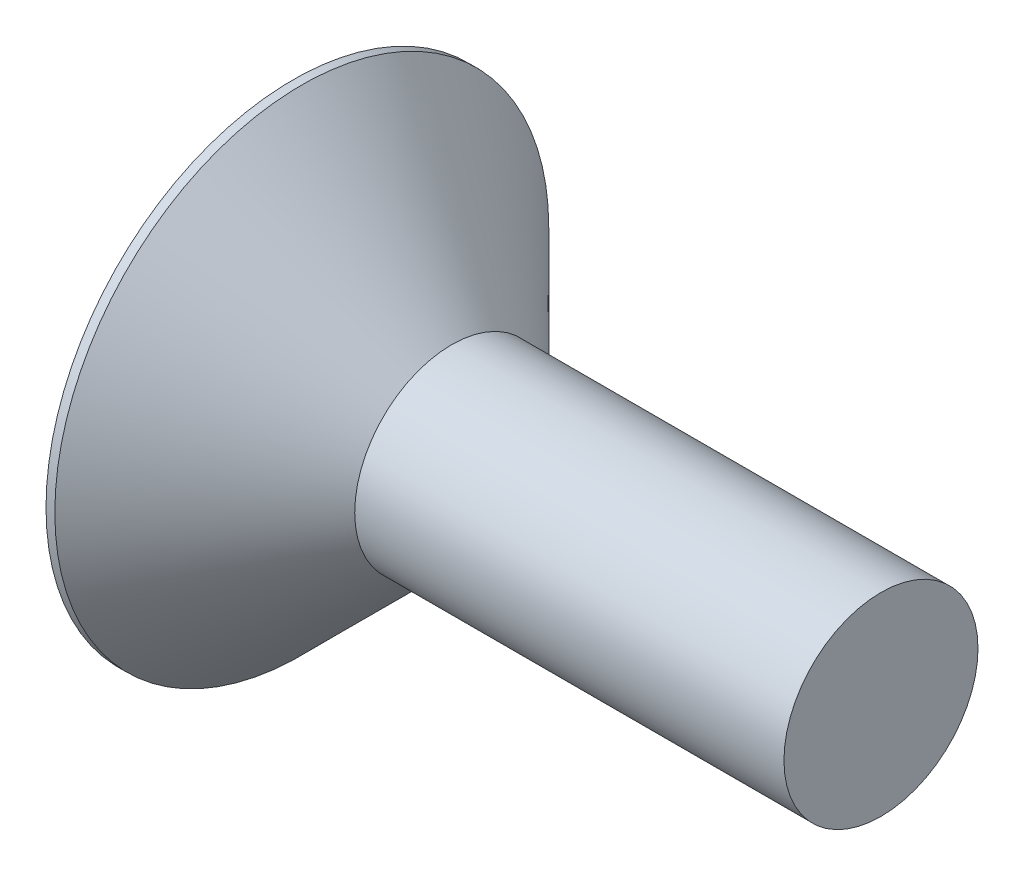
ISO-10303-21;
HEADER;
FILE_DESCRIPTION(('STEP AP214'),'2;1');
FILE_NAME('part.step','',(''),(''),'','','');
FILE_SCHEMA(('AUTOMOTIVE_DESIGN { 1 0 10303 214 1 1 1 1 }'));
ENDSEC;
DATA;
#1=APPLICATION_CONTEXT('core data for automotive mechanical design processes');
#2=APPLICATION_PROTOCOL_DEFINITION('international standard','automotive_design',2000,#1);
#3=PRODUCT_CONTEXT('',#1,'mechanical');
#4=PRODUCT('Part','Part','',(#3));
#5=PRODUCT_RELATED_PRODUCT_CATEGORY('part','',(#4));
#6=PRODUCT_DEFINITION_FORMATION('','',#4);
#7=PRODUCT_DEFINITION_CONTEXT('part definition',#1,'design');
#8=PRODUCT_DEFINITION('design','',#6,#7);
#9=PRODUCT_DEFINITION_SHAPE('','',#8);
#10=(LENGTH_UNIT() NAMED_UNIT(*) SI_UNIT(.MILLI.,.METRE.));
#11=(NAMED_UNIT(*) PLANE_ANGLE_UNIT() SI_UNIT($,.RADIAN.));
#12=(NAMED_UNIT(*) SI_UNIT($,.STERADIAN.) SOLID_ANGLE_UNIT());
#13=UNCERTAINTY_MEASURE_WITH_UNIT(LENGTH_MEASURE(1.E-05),#10,'distance_accuracy_value','');
#14=(GEOMETRIC_REPRESENTATION_CONTEXT(3) GLOBAL_UNCERTAINTY_ASSIGNED_CONTEXT((#13)) GLOBAL_UNIT_ASSIGNED_CONTEXT((#10,
#11,#12)) REPRESENTATION_CONTEXT('',''));
#15=CARTESIAN_POINT('',(0.,0.,0.));
#16=DIRECTION('',(0.,0.,1.));
#17=DIRECTION('',(1.,0.,0.));
#18=AXIS2_PLACEMENT_3D('',#15,#16,#17);
#19=CARTESIAN_POINT('',(2.51,-0.948560373066021,0.515));
#20=DIRECTION('',(0.,0.,-1.));
#21=DIRECTION('',(0.,1.,0.));
#22=AXIS2_PLACEMENT_3D('',#19,#20,#21);
#23=PLANE('',#22);
#24=DIRECTION('',(0.,-1.,0.));
#25=VECTOR('',#24,1.);
#26=CARTESIAN_POINT('',(0.,2.2,0.515));
#27=LINE('',#26,#25);
#28=CARTESIAN_POINT('',(0.,-0.887981255441156,0.515));
#29=VERTEX_POINT('',#28);
#30=CARTESIAN_POINT('',(0.,-2.2,0.515));
#31=VERTEX_POINT('',#30);
#32=EDGE_CURVE('E320',#29,#31,#27,.T.);
#33=ORIENTED_EDGE('',*,*,#32,.F.);
#34=CARTESIAN_POINT('',(-1.54977564647108,-1.01130800672325,0.515));
#35=CARTESIAN_POINT('',(-1.23788517270786,-0.986826571487756,0.515));
#36=CARTESIAN_POINT('',(-0.926007735565771,-0.962176117075243,0.515));
#37=CARTESIAN_POINT('',(-0.302275327552535,-0.912414378030123,0.515));
#38=CARTESIAN_POINT('',(0.00957964164275234,-0.887303072408851,0.515));
#39=CARTESIAN_POINT('',(0.477326867739133,-0.849200034708169,0.515));
#40=CARTESIAN_POINT('',(0.633236877534305,-0.836426330675361,0.515));
#41=CARTESIAN_POINT('',(0.945041873662967,-0.810710964612426,0.515));
#42=CARTESIAN_POINT('',(1.10093686010058,-0.797769303845589,0.515));
#43=CARTESIAN_POINT('',(1.41270333080025,-0.771692923127299,0.515));
#44=CARTESIAN_POINT('',(1.568574815822,-0.758558212266697,0.515));
#45=CARTESIAN_POINT('',(1.88030267392219,-0.732062350673588,0.515));
#46=CARTESIAN_POINT('',(2.03615904649583,-0.718701193999319,0.515));
#47=CARTESIAN_POINT('',(2.39015155243537,-0.688049903703303,0.515));
#48=CARTESIAN_POINT('',(2.58828060049309,-0.670677738711687,0.515));
#49=CARTESIAN_POINT('',(2.98448796441678,-0.635393509240391,0.515));
#50=CARTESIAN_POINT('',(3.18256628094361,-0.617481452196656,0.515));
#51=CARTESIAN_POINT('',(3.57863215535769,-0.580963231331761,0.515));
#52=CARTESIAN_POINT('',(3.77661972190122,-0.562357161801339,0.515));
#53=CARTESIAN_POINT('',(4.17251625795607,-0.524212007172804,0.515));
#54=CARTESIAN_POINT('',(4.37042522251482,-0.504672870529393,0.515));
#55=CARTESIAN_POINT('',(4.76621979461916,-0.464285859084882,0.515));
#56=CARTESIAN_POINT('',(4.96410533125768,-0.443437280097613,0.515));
#57=CARTESIAN_POINT('',(5.26075347563615,-0.410686203660742,0.515));
#58=CARTESIAN_POINT('',(5.35959766423708,-0.399523834486041,0.515));
#59=CARTESIAN_POINT('',(5.55721694475942,-0.376561771687499,0.515));
#60=CARTESIAN_POINT('',(5.65599203338541,-0.364762049521608,0.515));
#61=CARTESIAN_POINT('',(5.85350341178639,-0.340311623326566,0.515));
#62=CARTESIAN_POINT('',(5.95223963298654,-0.327660363079848,0.515));
#63=CARTESIAN_POINT('',(6.14954565491449,-0.301187906120118,0.515));
#64=CARTESIAN_POINT('',(6.24811547441257,-0.28736685180507,0.515));
#65=CARTESIAN_POINT('',(6.39580251584352,-0.265292479141727,0.515));
#66=CARTESIAN_POINT('',(6.44501926832323,-0.257707920234477,0.515));
#67=CARTESIAN_POINT('',(6.54335575747008,-0.241951993571022,0.515));
#68=CARTESIAN_POINT('',(6.59247550005062,-0.233780662792741,0.515));
#69=CARTESIAN_POINT('',(6.69060451408083,-0.216664965758528,0.515));
#70=CARTESIAN_POINT('',(6.73961373036193,-0.207720275734114,0.515));
#71=CARTESIAN_POINT('',(6.83741121304798,-0.188649708503354,0.515));
#72=CARTESIAN_POINT('',(6.88619942875591,-0.178523573247691,0.515));
#73=CARTESIAN_POINT('',(6.93482152088156,-0.167602986589417,0.515));
#74=B_SPLINE_CURVE_WITH_KNOTS('',3,(#34,#35,#36,#37,#38,#39,#40,#41,#42,#43,#44,#45,#46,#47,#48,
#49,#50,#51,#52,#53,#54,#55,#56,#57,#58,#59,#60,#61,#62,#63,#64,#65,#66,#67,#68,#69,#70,#71,#72,
#73),.UNSPECIFIED.,.F.,.F.,(4,2,2,2,2,2,2,2,2,2,2,2,2,2,2,2,2,2,2,4),(0.,0.938549774629289,
1.87714240047381,2.34643955056144,2.81573317286398,3.28500476619367,3.75428869196761,
4.35095567753757,4.94761444895151,5.54419244958818,6.14080344511287,6.73773807717728,
7.0361540303618,7.33458335835791,7.63320954593562,7.93179943415789,8.08118980055439,
8.23057076072988,8.38001456521923,8.52949107230012),.UNSPECIFIED.);
#75=CARTESIAN_POINT('',(2.51,-0.677477674908922,0.514999999999999));
#76=VERTEX_POINT('',#75);
#77=EDGE_CURVE('E200',#29,#76,#74,.T.);
#78=ORIENTED_EDGE('',*,*,#77,.T.);
#79=DIRECTION('',(0.,-1.,0.));
#80=VECTOR('',#79,1.);
#81=CARTESIAN_POINT('',(2.51,0.948560373066,0.515));
#82=LINE('',#81,#80);
#83=CARTESIAN_POINT('',(2.51,-0.948560373066021,0.515));
#84=VERTEX_POINT('',#83);
#85=EDGE_CURVE('E344',#76,#84,#82,.T.);
#86=ORIENTED_EDGE('',*,*,#85,.T.);
#87=DIRECTION('',(0.894934391398444,0.446197753347433,0.));
#88=VECTOR('',#87,1.);
#89=CARTESIAN_POINT('',(0.,-2.2,0.515));
#90=LINE('',#89,#88);
#91=EDGE_CURVE('E331',#31,#84,#90,.T.);
#92=ORIENTED_EDGE('',*,*,#91,.F.);
#93=EDGE_LOOP('',(#33,#78,#86,#92));
#94=FACE_BOUND('',#93,.T.);
#95=ADVANCED_FACE('F42',(#94),#23,.T.);
#96=CARTESIAN_POINT('',(2.51,0.948560373066,0.515));
#97=VERTEX_POINT('',#96);
#98=CARTESIAN_POINT('',(2.51,0.677477674908922,0.514999999999999));
#99=VERTEX_POINT('',#98);
#100=EDGE_CURVE('E346',#97,#99,#82,.T.);
#101=ORIENTED_EDGE('',*,*,#100,.T.);
#102=CARTESIAN_POINT('',(-1.54977564647108,1.01130800672325,0.515));
#103=CARTESIAN_POINT('',(-1.23788517270786,0.986826571487756,0.515));
#104=CARTESIAN_POINT('',(-0.92600773556577,0.962176117075243,0.515));
#105=CARTESIAN_POINT('',(-0.302275327552535,0.912414378030123,0.515));
#106=CARTESIAN_POINT('',(0.0095796416427524,0.887303072408851,0.515));
#107=CARTESIAN_POINT('',(0.477326867739133,0.849200034708169,0.515));
#108=CARTESIAN_POINT('',(0.633236877534305,0.836426330675361,0.515));
#109=CARTESIAN_POINT('',(0.945041873662967,0.810710964612426,0.515));
#110=CARTESIAN_POINT('',(1.10093686010058,0.797769303845589,0.515));
#111=CARTESIAN_POINT('',(1.41270333080025,0.7716929231273,0.515));
#112=CARTESIAN_POINT('',(1.56857481582201,0.758558212266697,0.515));
#113=CARTESIAN_POINT('',(1.8803026739222,0.732062350673588,0.515));
#114=CARTESIAN_POINT('',(2.03615904649584,0.718701193999319,0.515));
#115=CARTESIAN_POINT('',(2.39015155243537,0.688049903703303,0.515));
#116=CARTESIAN_POINT('',(2.58828060049309,0.670677738711687,0.515));
#117=CARTESIAN_POINT('',(2.98448796441678,0.635393509240391,0.515));
#118=CARTESIAN_POINT('',(3.18256628094361,0.617481452196656,0.515));
#119=CARTESIAN_POINT('',(3.57863215535769,0.580963231331761,0.515));
#120=CARTESIAN_POINT('',(3.77661972190122,0.562357161801339,0.515));
#121=CARTESIAN_POINT('',(4.17251625795608,0.524212007172804,0.515));
#122=CARTESIAN_POINT('',(4.37042522251483,0.504672870529393,0.515));
#123=CARTESIAN_POINT('',(4.76621979461917,0.464285859084882,0.515));
#124=CARTESIAN_POINT('',(4.96410533125768,0.443437280097613,0.515));
#125=CARTESIAN_POINT('',(5.26075347563615,0.410686203660742,0.515));
#126=CARTESIAN_POINT('',(5.35959766423708,0.399523834486041,0.515));
#127=CARTESIAN_POINT('',(5.55721694475942,0.376561771687499,0.515));
#128=CARTESIAN_POINT('',(5.65599203338541,0.364762049521608,0.515));
#129=CARTESIAN_POINT('',(5.8535034117864,0.340311623326566,0.515));
#130=CARTESIAN_POINT('',(5.95223963298654,0.327660363079848,0.515));
#131=CARTESIAN_POINT('',(6.14954565491449,0.301187906120117,0.515));
#132=CARTESIAN_POINT('',(6.24811547441257,0.28736685180507,0.515));
#133=CARTESIAN_POINT('',(6.39580251584353,0.265292479141726,0.515));
#134=CARTESIAN_POINT('',(6.44501926832323,0.257707920234476,0.515));
#135=CARTESIAN_POINT('',(6.54335575747008,0.241951993571022,0.515));
#136=CARTESIAN_POINT('',(6.59247550005062,0.233780662792741,0.515));
#137=CARTESIAN_POINT('',(6.69060451408084,0.216664965758528,0.515));
#138=CARTESIAN_POINT('',(6.73961373036193,0.207720275734114,0.515));
#139=CARTESIAN_POINT('',(6.83741121304798,0.188649708503353,0.515));
#140=CARTESIAN_POINT('',(6.88619942875591,0.178523573247691,0.515));
#141=CARTESIAN_POINT('',(6.93482152088157,0.167602986589416,0.515));
#142=B_SPLINE_CURVE_WITH_KNOTS('',3,(#102,#103,#104,#105,#106,#107,#108,#109,#110,#111,#112,
#113,#114,#115,#116,#117,#118,#119,#120,#121,#122,#123,#124,#125,#126,#127,#128,#129,#130,#131,
#132,#133,#134,#135,#136,#137,#138,#139,#140,#141),.UNSPECIFIED.,.F.,.F.,(4,2,2,2,2,2,2,2,2,2,2,
2,2,2,2,2,2,2,2,4),(0.,0.938549774629289,1.87714240047381,2.34643955056144,2.81573317286398,
3.28500476619367,3.75428869196761,4.35095567753757,4.94761444895151,5.54419244958818,
6.14080344511287,6.73773807717729,7.0361540303618,7.33458335835791,7.63320954593563,
7.93179943415789,8.0811898005544,8.23057076072988,8.38001456521923,8.52949107230012),.UNSPECIFIED.);
#143=CARTESIAN_POINT('',(0.,0.887981255441157,0.515));
#144=VERTEX_POINT('',#143);
#145=EDGE_CURVE('E193',#99,#144,#142,.F.);
#146=ORIENTED_EDGE('',*,*,#145,.T.);
#147=CARTESIAN_POINT('',(0.,2.2,0.515));
#148=VERTEX_POINT('',#147);
#149=EDGE_CURVE('E322',#148,#144,#27,.T.);
#150=ORIENTED_EDGE('',*,*,#149,.F.);
#151=DIRECTION('',(0.894934391398441,-0.446197753347439,0.));
#152=VECTOR('',#151,1.);
#153=CARTESIAN_POINT('',(0.,2.2,0.515));
#154=LINE('',#153,#152);
#155=EDGE_CURVE('E71',#148,#97,#154,.T.);
#156=ORIENTED_EDGE('',*,*,#155,.T.);
#157=EDGE_LOOP('',(#101,#146,#150,#156));
#158=FACE_BOUND('',#157,.T.);
#159=ADVANCED_FACE('F175',(#158),#23,.T.);
#160=CARTESIAN_POINT('',(2.51,0.948560373066,-0.515));
#161=DIRECTION('',(0.,0.,1.));
#162=DIRECTION('',(1.,0.,0.));
#163=AXIS2_PLACEMENT_3D('',#160,#161,#162);
#164=PLANE('',#163);
#165=DIRECTION('',(0.,1.,0.));
#166=VECTOR('',#165,1.);
#167=CARTESIAN_POINT('',(2.51,-0.948560373066021,-0.515));
#168=LINE('',#167,#166);
#169=CARTESIAN_POINT('',(2.51,-0.948560373066021,-0.515));
#170=VERTEX_POINT('',#169);
#171=CARTESIAN_POINT('',(2.51,-0.677477674908922,-0.514999999999999));
#172=VERTEX_POINT('',#171);
#173=EDGE_CURVE('E345',#170,#172,#168,.T.);
#174=ORIENTED_EDGE('',*,*,#173,.T.);
#175=CARTESIAN_POINT('',(-1.54977564528431,-1.01130800663012,-0.514999999999999));
#176=CARTESIAN_POINT('',(-1.23788517166282,-0.986826571405297,-0.515));
#177=CARTESIAN_POINT('',(-0.926007734662458,-0.962176117003548,-0.515));
#178=CARTESIAN_POINT('',(-0.302275326932694,-0.912414377980291,-0.515));
#179=CARTESIAN_POINT('',(0.00957964212084647,-0.887303072370117,-0.515));
#180=CARTESIAN_POINT('',(0.477326867945249,-0.849200034691274,-0.515));
#181=CARTESIAN_POINT('',(0.63323687761018,-0.836426330669084,-0.515));
#182=CARTESIAN_POINT('',(0.945041873478389,-0.810710964627669,-0.515));
#183=CARTESIAN_POINT('',(1.10093685978579,-0.797769303871732,-0.515));
#184=CARTESIAN_POINT('',(1.41270333022509,-0.771692923175592,-0.515));
#185=CARTESIAN_POINT('',(1.56857481511669,-0.758558212326239,-0.515));
#186=CARTESIAN_POINT('',(1.8803026729566,-0.732062350756069,-0.515));
#187=CARTESIAN_POINT('',(2.03615904540011,-0.71870119409349,-0.515));
#188=CARTESIAN_POINT('',(2.39015155120943,-0.688049903810352,-0.515));
#189=CARTESIAN_POINT('',(2.58828059926706,-0.670677738819741,-0.515));
#190=CARTESIAN_POINT('',(2.98448796319059,-0.635393509350721,-0.515));
#191=CARTESIAN_POINT('',(3.18256627971735,-0.617481452308258,-0.515));
#192=CARTESIAN_POINT('',(3.57863215413144,-0.580963231446289,-0.515));
#193=CARTESIAN_POINT('',(3.77661972067504,-0.56235716191752,-0.515));
#194=CARTESIAN_POINT('',(4.17251625673005,-0.524212007292897,-0.515));
#195=CARTESIAN_POINT('',(4.37042522128889,-0.504672870651743,-0.515));
#196=CARTESIAN_POINT('',(4.76621979339322,-0.464285859212756,-0.515));
#197=CARTESIAN_POINT('',(4.96410533003164,-0.443437280228755,-0.515));
#198=CARTESIAN_POINT('',(5.26075347441022,-0.410686203798173,-0.515));
#199=CARTESIAN_POINT('',(5.35959766301126,-0.399523834625795,-0.515));
#200=CARTESIAN_POINT('',(5.5572169435339,-0.376561771832591,-0.515));
#201=CARTESIAN_POINT('',(5.65599203216008,-0.364762049669715,-0.515));
#202=CARTESIAN_POINT('',(5.85350341056136,-0.340311623481798,-0.515));
#203=CARTESIAN_POINT('',(5.95223963176162,-0.327660363239192,-0.515));
#204=CARTESIAN_POINT('',(6.14954565369015,-0.301187906289447,-0.515));
#205=CARTESIAN_POINT('',(6.24811547318869,-0.28736685198027,-0.515000000000001));
#206=CARTESIAN_POINT('',(6.39580251462068,-0.265292479328335,-0.515000000000001));
#207=CARTESIAN_POINT('',(6.44501926710072,-0.257707920425335,-0.515000000000001));
#208=CARTESIAN_POINT('',(6.54335575624853,-0.241951993771733,-0.515000000000001));
#209=CARTESIAN_POINT('',(6.5924754988297,-0.233780662999055,-0.515000000000001));
#210=CARTESIAN_POINT('',(6.6906045128615,-0.216664965978082,-0.515000000000001));
#211=CARTESIAN_POINT('',(6.73961372914354,-0.207720275961309,-0.515000000000001));
#212=CARTESIAN_POINT('',(6.83741121183248,-0.18864970875004,-0.515000000000001));
#213=CARTESIAN_POINT('',(6.88619942754234,-0.178523573506231,-0.515000000000001));
#214=CARTESIAN_POINT('',(6.9348215196708,-0.167602986862998,-0.515000000000001));
#215=B_SPLINE_CURVE_WITH_KNOTS('',3,(#175,#176,#177,#178,#179,#180,#181,#182,#183,#184,#185,
#186,#187,#188,#189,#190,#191,#192,#193,#194,#195,#196,#197,#198,#199,#200,#201,#202,#203,#204,
#205,#206,#207,#208,#209,#210,#211,#212,#213,#214),.UNSPECIFIED.,.F.,.F.,(4,2,2,2,2,2,2,2,2,2,2,
2,2,2,2,2,2,2,2,4),(0.,0.938549774202895,1.87714239962088,2.34643954931649,2.81573317122702,
3.2850047641648,3.75428868954677,4.35095567511618,4.9476144465296,5.54419244716601,
6.14080344269031,6.73773807475341,7.03615402793748,7.33458335593309,7.63320954350958,
7.93179943173082,8.08118979812638,8.23057075830099,8.3800145627891,8.52949106986851),.UNSPECIFIED.);
#216=CARTESIAN_POINT('',(0.,-0.887981255441157,-0.515));
#217=VERTEX_POINT('',#216);
#218=EDGE_CURVE('E246',#172,#217,#215,.F.);
#219=ORIENTED_EDGE('',*,*,#218,.T.);
#220=DIRECTION('',(0.,1.,0.));
#221=VECTOR('',#220,1.);
#222=CARTESIAN_POINT('',(0.,-2.2,-0.515));
#223=LINE('',#222,#221);
#224=CARTESIAN_POINT('',(0.,-2.2,-0.515));
#225=VERTEX_POINT('',#224);
#226=EDGE_CURVE('E321',#225,#217,#223,.T.);
#227=ORIENTED_EDGE('',*,*,#226,.F.);
#228=DIRECTION('',(0.894934391398444,0.446197753347433,0.));
#229=VECTOR('',#228,1.);
#230=CARTESIAN_POINT('',(0.,-2.2,-0.515));
#231=LINE('',#230,#229);
#232=EDGE_CURVE('E334',#225,#170,#231,.T.);
#233=ORIENTED_EDGE('',*,*,#232,.T.);
#234=EDGE_LOOP('',(#174,#219,#227,#233));
#235=FACE_BOUND('',#234,.T.);
#236=ADVANCED_FACE('F181',(#235),#164,.T.);
#237=CARTESIAN_POINT('',(0.,0.887981255441157,-0.515));
#238=VERTEX_POINT('',#237);
#239=CARTESIAN_POINT('',(0.,2.2,-0.515));
#240=VERTEX_POINT('',#239);
#241=EDGE_CURVE('E330',#238,#240,#223,.T.);
#242=ORIENTED_EDGE('',*,*,#241,.F.);
#243=CARTESIAN_POINT('',(-1.54977564528431,1.01130800663012,-0.514999999999999));
#244=CARTESIAN_POINT('',(-1.23788517166282,0.986826571405296,-0.515));
#245=CARTESIAN_POINT('',(-0.926007734662458,0.962176117003547,-0.515));
#246=CARTESIAN_POINT('',(-0.302275326932694,0.912414377980291,-0.515));
#247=CARTESIAN_POINT('',(0.00957964212084625,0.887303072370118,-0.515));
#248=CARTESIAN_POINT('',(0.477326867945249,0.849200034691274,-0.515));
#249=CARTESIAN_POINT('',(0.63323687761018,0.836426330669085,-0.515));
#250=CARTESIAN_POINT('',(0.945041873478388,0.810710964627669,-0.515));
#251=CARTESIAN_POINT('',(1.10093685978579,0.797769303871732,-0.515));
#252=CARTESIAN_POINT('',(1.41270333022509,0.771692923175592,-0.515));
#253=CARTESIAN_POINT('',(1.56857481511669,0.758558212326239,-0.515));
#254=CARTESIAN_POINT('',(1.8803026729566,0.732062350756069,-0.515));
#255=CARTESIAN_POINT('',(2.03615904540011,0.71870119409349,-0.515));
#256=CARTESIAN_POINT('',(2.39015155120942,0.688049903810353,-0.515));
#257=CARTESIAN_POINT('',(2.58828059926705,0.670677738819741,-0.515));
#258=CARTESIAN_POINT('',(2.98448796319058,0.635393509350721,-0.515));
#259=CARTESIAN_POINT('',(3.18256627971735,0.617481452308258,-0.515));
#260=CARTESIAN_POINT('',(3.57863215413144,0.580963231446289,-0.515));
#261=CARTESIAN_POINT('',(3.77661972067504,0.562357161917521,-0.515));
#262=CARTESIAN_POINT('',(4.17251625673005,0.524212007292897,-0.515));
#263=CARTESIAN_POINT('',(4.37042522128889,0.504672870651743,-0.515));
#264=CARTESIAN_POINT('',(4.76621979339322,0.464285859212756,-0.515));
#265=CARTESIAN_POINT('',(4.96410533003163,0.443437280228755,-0.515));
#266=CARTESIAN_POINT('',(5.26075347441021,0.410686203798173,-0.515));
#267=CARTESIAN_POINT('',(5.35959766301126,0.399523834625796,-0.515));
#268=CARTESIAN_POINT('',(5.5572169435339,0.376561771832592,-0.515));
#269=CARTESIAN_POINT('',(5.65599203216007,0.364762049669715,-0.515));
#270=CARTESIAN_POINT('',(5.85350341056136,0.340311623481798,-0.515));
#271=CARTESIAN_POINT('',(5.95223963176162,0.327660363239193,-0.515));
#272=CARTESIAN_POINT('',(6.14954565369014,0.301187906289447,-0.515));
#273=CARTESIAN_POINT('',(6.24811547318869,0.287366851980271,-0.515000000000001));
#274=CARTESIAN_POINT('',(6.39580251462068,0.265292479328335,-0.515000000000001));
#275=CARTESIAN_POINT('',(6.44501926710072,0.257707920425335,-0.515000000000001));
#276=CARTESIAN_POINT('',(6.54335575624853,0.241951993771733,-0.515000000000001));
#277=CARTESIAN_POINT('',(6.5924754988297,0.233780662999055,-0.515000000000001));
#278=CARTESIAN_POINT('',(6.69060451286149,0.216664965978083,-0.515000000000001));
#279=CARTESIAN_POINT('',(6.73961372914354,0.20772027596131,-0.515000000000001));
#280=CARTESIAN_POINT('',(6.83741121183247,0.188649708750041,-0.515000000000001));
#281=CARTESIAN_POINT('',(6.88619942754234,0.178523573506232,-0.515000000000001));
#282=CARTESIAN_POINT('',(6.9348215196708,0.167602986862999,-0.515000000000001));
#283=B_SPLINE_CURVE_WITH_KNOTS('',3,(#243,#244,#245,#246,#247,#248,#249,#250,#251,#252,#253,
#254,#255,#256,#257,#258,#259,#260,#261,#262,#263,#264,#265,#266,#267,#268,#269,#270,#271,#272,
#273,#274,#275,#276,#277,#278,#279,#280,#281,#282),.UNSPECIFIED.,.F.,.F.,(4,2,2,2,2,2,2,2,2,2,2,
2,2,2,2,2,2,2,2,4),(0.,0.938549774202895,1.87714239962088,2.34643954931649,2.81573317122702,
3.2850047641648,3.75428868954677,4.35095567511618,4.9476144465296,5.544192447166,
6.1408034426903,6.7377380747534,7.03615402793748,7.33458335593308,7.63320954350958,
7.93179943173082,8.08118979812638,8.23057075830099,8.38001456278909,8.5294910698685),.UNSPECIFIED.);
#284=CARTESIAN_POINT('',(2.51,0.677477674908922,-0.514999999999999));
#285=VERTEX_POINT('',#284);
#286=EDGE_CURVE('E241',#238,#285,#283,.T.);
#287=ORIENTED_EDGE('',*,*,#286,.T.);
#288=CARTESIAN_POINT('',(2.51,0.948560373066,-0.515));
#289=VERTEX_POINT('',#288);
#290=EDGE_CURVE('E351',#285,#289,#168,.T.);
#291=ORIENTED_EDGE('',*,*,#290,.T.);
#292=DIRECTION('',(0.894934391398441,-0.446197753347439,0.));
#293=VECTOR('',#292,1.);
#294=CARTESIAN_POINT('',(0.,2.2,-0.515));
#295=LINE('',#294,#293);
#296=EDGE_CURVE('E338',#240,#289,#295,.T.);
#297=ORIENTED_EDGE('',*,*,#296,.F.);
#298=EDGE_LOOP('',(#242,#287,#291,#297));
#299=FACE_BOUND('',#298,.T.);
#300=ADVANCED_FACE('F407',(#299),#164,.T.);
#301=CARTESIAN_POINT('',(2.51,0.948560373066,-0.515));
#302=DIRECTION('',(1.,0.,0.));
#303=DIRECTION('',(0.,0.,-1.));
#304=AXIS2_PLACEMENT_3D('',#301,#302,#303);
#305=PLANE('',#304);
#306=CARTESIAN_POINT('',(2.51,0.,0.));
#307=DIRECTION('',(-1.,0.,0.));
#308=DIRECTION('',(0.,0.,1.));
#309=AXIS2_PLACEMENT_3D('',#306,#307,#308);
#310=CIRCLE('',#309,0.850999999999999);
#311=EDGE_CURVE('E290',#172,#76,#310,.T.);
#312=ORIENTED_EDGE('',*,*,#311,.F.);
#313=ORIENTED_EDGE('',*,*,#173,.F.);
#314=DIRECTION('',(0.,0.,-1.));
#315=VECTOR('',#314,1.);
#316=CARTESIAN_POINT('',(2.51,-0.948560373066021,0.515));
#317=LINE('',#316,#315);
#318=EDGE_CURVE('E341',#84,#170,#317,.T.);
#319=ORIENTED_EDGE('',*,*,#318,.F.);
#320=ORIENTED_EDGE('',*,*,#85,.F.);
#321=EDGE_LOOP('',(#312,#313,#319,#320));
#322=FACE_BOUND('',#321,.T.);
#323=ADVANCED_FACE('F385',(#322),#305,.F.);
#324=CARTESIAN_POINT('',(2.51,-0.515000000000002,0.67747767490892));
#325=VERTEX_POINT('',#324);
#326=CARTESIAN_POINT('',(2.51,0.514999999999998,0.677477674908925));
#327=VERTEX_POINT('',#326);
#328=EDGE_CURVE('E283',#325,#327,#310,.T.);
#329=ORIENTED_EDGE('',*,*,#328,.F.);
#330=DIRECTION('',(0.,0.,-1.));
#331=VECTOR('',#330,1.);
#332=CARTESIAN_POINT('',(2.51,-0.515000000000003,0.948560373065998));
#333=LINE('',#332,#331);
#334=CARTESIAN_POINT('',(2.51,-0.515000000000003,0.948560373065998));
#335=VERTEX_POINT('',#334);
#336=EDGE_CURVE('E441',#335,#325,#333,.T.);
#337=ORIENTED_EDGE('',*,*,#336,.F.);
#338=DIRECTION('',(0.,-1.,0.));
#339=VECTOR('',#338,1.);
#340=CARTESIAN_POINT('',(2.51,0.514999999999997,0.948560373066002));
#341=LINE('',#340,#339);
#342=CARTESIAN_POINT('',(2.51,0.514999999999997,0.948560373066002));
#343=VERTEX_POINT('',#342);
#344=EDGE_CURVE('E309',#343,#335,#341,.T.);
#345=ORIENTED_EDGE('',*,*,#344,.F.);
#346=DIRECTION('',(0.,0.,1.));
#347=VECTOR('',#346,1.);
#348=CARTESIAN_POINT('',(2.51,0.515000000000003,-0.948560373066019));
#349=LINE('',#348,#347);
#350=EDGE_CURVE('E207',#327,#343,#349,.T.);
#351=ORIENTED_EDGE('',*,*,#350,.F.);
#352=EDGE_LOOP('',(#329,#337,#345,#351));
#353=FACE_BOUND('',#352,.T.);
#354=ADVANCED_FACE('F406',(#353),#305,.F.);
#355=EDGE_CURVE('E282',#99,#285,#310,.T.);
#356=ORIENTED_EDGE('',*,*,#355,.F.);
#357=ORIENTED_EDGE('',*,*,#100,.F.);
#358=DIRECTION('',(0.,0.,1.));
#359=VECTOR('',#358,1.);
#360=CARTESIAN_POINT('',(2.51,0.948560373066,-0.515));
#361=LINE('',#360,#359);
#362=EDGE_CURVE('E342',#289,#97,#361,.T.);
#363=ORIENTED_EDGE('',*,*,#362,.F.);
#364=ORIENTED_EDGE('',*,*,#290,.F.);
#365=EDGE_LOOP('',(#356,#357,#363,#364));
#366=FACE_BOUND('',#365,.T.);
#367=ADVANCED_FACE('F386',(#366),#305,.F.);
#368=CARTESIAN_POINT('',(2.51,0.514999999999997,0.948560373066002));
#369=DIRECTION('',(0.,-1.,0.));
#370=DIRECTION('',(1.,0.,0.));
#371=AXIS2_PLACEMENT_3D('',#368,#369,#370);
#372=PLANE('',#371);
#373=CARTESIAN_POINT('',(2.51,0.515000000000003,-0.948560373066019));
#374=VERTEX_POINT('',#373);
#375=CARTESIAN_POINT('',(2.51,0.515000000000002,-0.67747767490892));
#376=VERTEX_POINT('',#375);
#377=EDGE_CURVE('E304',#374,#376,#349,.T.);
#378=ORIENTED_EDGE('',*,*,#377,.T.);
#379=CARTESIAN_POINT('',(-1.54977564647108,0.515000000000003,-1.01130800672325));
#380=CARTESIAN_POINT('',(-1.23788517270786,0.515000000000003,-0.986826571487754));
#381=CARTESIAN_POINT('',(-0.926007735565771,0.515000000000003,-0.962176117075241));
#382=CARTESIAN_POINT('',(-0.302275327552535,0.515000000000003,-0.912414378030122));
#383=CARTESIAN_POINT('',(0.00957964164275196,0.515000000000003,-0.887303072408849));
#384=CARTESIAN_POINT('',(0.477326867739133,0.515000000000003,-0.849200034708167));
#385=CARTESIAN_POINT('',(0.633236877534305,0.515000000000003,-0.83642633067536));
#386=CARTESIAN_POINT('',(0.945041873662967,0.515000000000003,-0.810710964612425));
#387=CARTESIAN_POINT('',(1.10093686010058,0.515000000000003,-0.797769303845587));
#388=CARTESIAN_POINT('',(1.41270333080025,0.515000000000003,-0.771692923127298));
#389=CARTESIAN_POINT('',(1.568574815822,0.515000000000003,-0.758558212266696));
#390=CARTESIAN_POINT('',(1.88030267392219,0.515000000000003,-0.732062350673587));
#391=CARTESIAN_POINT('',(2.03615904649583,0.515000000000002,-0.718701193999318));
#392=CARTESIAN_POINT('',(2.39015155243537,0.515000000000002,-0.688049903703301));
#393=CARTESIAN_POINT('',(2.58828060049309,0.515000000000002,-0.670677738711685));
#394=CARTESIAN_POINT('',(2.98448796441678,0.515000000000002,-0.635393509240389));
#395=CARTESIAN_POINT('',(3.18256628094361,0.515000000000002,-0.617481452196654));
#396=CARTESIAN_POINT('',(3.57863215535769,0.515000000000002,-0.580963231331759));
#397=CARTESIAN_POINT('',(3.77661972190122,0.515000000000002,-0.562357161801337));
#398=CARTESIAN_POINT('',(4.17251625795607,0.515000000000002,-0.524212007172802));
#399=CARTESIAN_POINT('',(4.37042522251482,0.515000000000002,-0.504672870529391));
#400=CARTESIAN_POINT('',(4.76621979461916,0.515000000000002,-0.46428585908488));
#401=CARTESIAN_POINT('',(4.96410533125768,0.515000000000002,-0.443437280097611));
#402=CARTESIAN_POINT('',(5.26075347563615,0.515000000000002,-0.41068620366074));
#403=CARTESIAN_POINT('',(5.35959766423708,0.515000000000002,-0.399523834486039));
#404=CARTESIAN_POINT('',(5.55721694475942,0.515000000000002,-0.376561771687497));
#405=CARTESIAN_POINT('',(5.65599203338541,0.515000000000002,-0.364762049521606));
#406=CARTESIAN_POINT('',(5.8535034117864,0.515000000000002,-0.340311623326564));
#407=CARTESIAN_POINT('',(5.95223963298654,0.515000000000002,-0.327660363079846));
#408=CARTESIAN_POINT('',(6.14954565491449,0.515000000000002,-0.301187906120116));
#409=CARTESIAN_POINT('',(6.24811547441257,0.515000000000002,-0.287366851805068));
#410=CARTESIAN_POINT('',(6.39580251584352,0.515000000000001,-0.265292479141724));
#411=CARTESIAN_POINT('',(6.44501926832323,0.515000000000001,-0.257707920234475));
#412=CARTESIAN_POINT('',(6.54335575747008,0.515000000000001,-0.24195199357102));
#413=CARTESIAN_POINT('',(6.59247550005062,0.515000000000001,-0.233780662792739));
#414=CARTESIAN_POINT('',(6.69060451408083,0.515000000000001,-0.216664965758526));
#415=CARTESIAN_POINT('',(6.73961373036193,0.515000000000001,-0.207720275734112));
#416=CARTESIAN_POINT('',(6.83741121304798,0.515000000000001,-0.188649708503352));
#417=CARTESIAN_POINT('',(6.88619942875591,0.515000000000001,-0.178523573247689));
#418=CARTESIAN_POINT('',(6.93482152088156,0.515000000000001,-0.167602986589414));
#419=B_SPLINE_CURVE_WITH_KNOTS('',3,(#379,#380,#381,#382,#383,#384,#385,#386,#387,#388,#389,
#390,#391,#392,#393,#394,#395,#396,#397,#398,#399,#400,#401,#402,#403,#404,#405,#406,#407,#408,
#409,#410,#411,#412,#413,#414,#415,#416,#417,#418),.UNSPECIFIED.,.F.,.F.,(4,2,2,2,2,2,2,2,2,2,2,
2,2,2,2,2,2,2,2,4),(0.,0.938549774629289,1.87714240047381,2.34643955056144,2.81573317286398,
3.28500476619367,3.75428869196761,4.35095567753757,4.94761444895151,5.54419244958818,
6.14080344511287,6.73773807717728,7.0361540303618,7.33458335835791,7.63320954593562,
7.93179943415789,8.08118980055439,8.23057076072988,8.38001456521922,8.52949107230012),.UNSPECIFIED.);
#420=CARTESIAN_POINT('',(0.,0.515000000000003,-0.887981255441155));
#421=VERTEX_POINT('',#420);
#422=EDGE_CURVE('E234',#376,#421,#419,.F.);
#423=ORIENTED_EDGE('',*,*,#422,.T.);
#424=DIRECTION('',(0.,0.,1.));
#425=VECTOR('',#424,1.);
#426=CARTESIAN_POINT('',(0.,0.515000000000007,-2.2));
#427=LINE('',#426,#425);
#428=CARTESIAN_POINT('',(0.,0.515000000000007,-2.2));
#429=VERTEX_POINT('',#428);
#430=EDGE_CURVE('E430',#429,#421,#427,.T.);
#431=ORIENTED_EDGE('',*,*,#430,.F.);
#432=DIRECTION('',(0.894934391398444,0.,0.446197753347433));
#433=VECTOR('',#432,1.);
#434=CARTESIAN_POINT('',(0.,0.515000000000007,-2.2));
#435=LINE('',#434,#433);
#436=EDGE_CURVE('E308',#429,#374,#435,.T.);
#437=ORIENTED_EDGE('',*,*,#436,.T.);
#438=EDGE_LOOP('',(#378,#423,#431,#437));
#439=FACE_BOUND('',#438,.T.);
#440=ADVANCED_FACE('F307',(#439),#372,.T.);
#441=CARTESIAN_POINT('',(2.51,-0.514999999999997,-0.948560373066022));
#442=DIRECTION('',(0.,1.,0.));
#443=DIRECTION('',(0.,0.,1.));
#444=AXIS2_PLACEMENT_3D('',#441,#442,#443);
#445=PLANE('',#444);
#446=DIRECTION('',(0.,0.,-1.));
#447=VECTOR('',#446,1.);
#448=CARTESIAN_POINT('',(0.,-0.515000000000007,2.2));
#449=LINE('',#448,#447);
#450=CARTESIAN_POINT('',(0.,-0.514999999999997,-0.887981255441158));
#451=VERTEX_POINT('',#450);
#452=CARTESIAN_POINT('',(0.,-0.514999999999993,-2.2));
#453=VERTEX_POINT('',#452);
#454=EDGE_CURVE('E448',#451,#453,#449,.T.);
#455=ORIENTED_EDGE('',*,*,#454,.F.);
#456=CARTESIAN_POINT('',(-1.54977564647107,-0.514999999999996,-1.01130800672325));
#457=CARTESIAN_POINT('',(-1.23788517270786,-0.514999999999997,-0.986826571487757));
#458=CARTESIAN_POINT('',(-0.92600773556577,-0.514999999999997,-0.962176117075245));
#459=CARTESIAN_POINT('',(-0.302275327552535,-0.514999999999997,-0.912414378030125));
#460=CARTESIAN_POINT('',(0.00957964164275234,-0.514999999999997,-0.887303072408852));
#461=CARTESIAN_POINT('',(0.477326867739133,-0.514999999999997,-0.849200034708171));
#462=CARTESIAN_POINT('',(0.633236877534306,-0.514999999999997,-0.836426330675363));
#463=CARTESIAN_POINT('',(0.945041873662967,-0.514999999999997,-0.810710964612428));
#464=CARTESIAN_POINT('',(1.10093686010058,-0.514999999999997,-0.797769303845591));
#465=CARTESIAN_POINT('',(1.41270333080025,-0.514999999999997,-0.771692923127301));
#466=CARTESIAN_POINT('',(1.568574815822,-0.514999999999997,-0.758558212266699));
#467=CARTESIAN_POINT('',(1.88030267392219,-0.514999999999998,-0.73206235067359));
#468=CARTESIAN_POINT('',(2.03615904649583,-0.514999999999998,-0.718701193999321));
#469=CARTESIAN_POINT('',(2.39015155243537,-0.514999999999998,-0.688049903703305));
#470=CARTESIAN_POINT('',(2.58828060049309,-0.514999999999998,-0.670677738711689));
#471=CARTESIAN_POINT('',(2.98448796441678,-0.514999999999998,-0.635393509240392));
#472=CARTESIAN_POINT('',(3.18256628094361,-0.514999999999998,-0.617481452196657));
#473=CARTESIAN_POINT('',(3.57863215535769,-0.514999999999998,-0.580963231331762));
#474=CARTESIAN_POINT('',(3.77661972190122,-0.514999999999998,-0.562357161801341));
#475=CARTESIAN_POINT('',(4.17251625795608,-0.514999999999998,-0.524212007172806));
#476=CARTESIAN_POINT('',(4.37042522251483,-0.514999999999999,-0.504672870529395));
#477=CARTESIAN_POINT('',(4.76621979461917,-0.514999999999999,-0.464285859084884));
#478=CARTESIAN_POINT('',(4.96410533125768,-0.514999999999999,-0.443437280097615));
#479=CARTESIAN_POINT('',(5.26075347563615,-0.514999999999999,-0.410686203660743));
#480=CARTESIAN_POINT('',(5.35959766423708,-0.514999999999999,-0.399523834486043));
#481=CARTESIAN_POINT('',(5.55721694475942,-0.514999999999999,-0.376561771687501));
#482=CARTESIAN_POINT('',(5.65599203338541,-0.514999999999999,-0.364762049521609));
#483=CARTESIAN_POINT('',(5.8535034117864,-0.514999999999999,-0.340311623326568));
#484=CARTESIAN_POINT('',(5.95223963298654,-0.514999999999999,-0.32766036307985));
#485=CARTESIAN_POINT('',(6.14954565491449,-0.514999999999999,-0.301187906120119));
#486=CARTESIAN_POINT('',(6.24811547441257,-0.514999999999999,-0.287366851805072));
#487=CARTESIAN_POINT('',(6.39580251584353,-0.514999999999999,-0.265292479141728));
#488=CARTESIAN_POINT('',(6.44501926832323,-0.514999999999999,-0.257707920234478));
#489=CARTESIAN_POINT('',(6.54335575747008,-0.514999999999999,-0.241951993571023));
#490=CARTESIAN_POINT('',(6.59247550005062,-0.515,-0.233780662792743));
#491=CARTESIAN_POINT('',(6.69060451408084,-0.515,-0.21666496575853));
#492=CARTESIAN_POINT('',(6.73961373036193,-0.515,-0.207720275734116));
#493=CARTESIAN_POINT('',(6.83741121304798,-0.515,-0.188649708503355));
#494=CARTESIAN_POINT('',(6.88619942875591,-0.515,-0.178523573247693));
#495=CARTESIAN_POINT('',(6.93482152088156,-0.515,-0.167602986589418));
#496=B_SPLINE_CURVE_WITH_KNOTS('',3,(#456,#457,#458,#459,#460,#461,#462,#463,#464,#465,#466,
#467,#468,#469,#470,#471,#472,#473,#474,#475,#476,#477,#478,#479,#480,#481,#482,#483,#484,#485,
#486,#487,#488,#489,#490,#491,#492,#493,#494,#495),.UNSPECIFIED.,.F.,.F.,(4,2,2,2,2,2,2,2,2,2,2,
2,2,2,2,2,2,2,2,4),(0.,0.938549774629289,1.87714240047381,2.34643955056144,2.81573317286398,
3.28500476619367,3.75428869196761,4.35095567753757,4.94761444895151,5.54419244958818,
6.14080344511287,6.73773807717729,7.0361540303618,7.33458335835791,7.63320954593563,
7.93179943415789,8.0811898005544,8.23057076072988,8.38001456521923,8.52949107230012),.UNSPECIFIED.);
#497=CARTESIAN_POINT('',(2.51,-0.514999999999998,-0.677477674908923));
#498=VERTEX_POINT('',#497);
#499=EDGE_CURVE('E227',#451,#498,#496,.T.);
#500=ORIENTED_EDGE('',*,*,#499,.T.);
#501=CARTESIAN_POINT('',(2.51,-0.514999999999997,-0.948560373066022));
#502=VERTEX_POINT('',#501);
#503=EDGE_CURVE('E306',#498,#502,#333,.T.);
#504=ORIENTED_EDGE('',*,*,#503,.T.);
#505=DIRECTION('',(0.894934391398444,0.,0.446197753347433));
#506=VECTOR('',#505,1.);
#507=CARTESIAN_POINT('',(0.,-0.514999999999993,-2.2));
#508=LINE('',#507,#506);
#509=EDGE_CURVE('E431',#453,#502,#508,.T.);
#510=ORIENTED_EDGE('',*,*,#509,.F.);
#511=EDGE_LOOP('',(#455,#500,#504,#510));
#512=FACE_BOUND('',#511,.T.);
#513=ADVANCED_FACE('F444',(#512),#445,.T.);
#514=ORIENTED_EDGE('',*,*,#336,.T.);
#515=CARTESIAN_POINT('',(-1.54977564528431,-0.515000000000003,1.01130800663012));
#516=CARTESIAN_POINT('',(-1.23788517166282,-0.515000000000003,0.986826571405294));
#517=CARTESIAN_POINT('',(-0.926007734662459,-0.515000000000003,0.962176117003546));
#518=CARTESIAN_POINT('',(-0.302275326932694,-0.515000000000003,0.912414377980289));
#519=CARTESIAN_POINT('',(0.00957964212084566,-0.515000000000003,0.887303072370116));
#520=CARTESIAN_POINT('',(0.477326867945248,-0.515000000000003,0.849200034691272));
#521=CARTESIAN_POINT('',(0.63323687761018,-0.515000000000003,0.836426330669083));
#522=CARTESIAN_POINT('',(0.945041873478388,-0.515000000000003,0.810710964627667));
#523=CARTESIAN_POINT('',(1.10093685978579,-0.515000000000003,0.797769303871731));
#524=CARTESIAN_POINT('',(1.41270333022509,-0.515000000000003,0.771692923175591));
#525=CARTESIAN_POINT('',(1.56857481511669,-0.515000000000003,0.758558212326237));
#526=CARTESIAN_POINT('',(1.8803026729566,-0.515000000000003,0.732062350756067));
#527=CARTESIAN_POINT('',(2.03615904540011,-0.515000000000002,0.718701194093488));
#528=CARTESIAN_POINT('',(2.39015155120943,-0.515000000000002,0.688049903810351));
#529=CARTESIAN_POINT('',(2.58828059926706,-0.515000000000002,0.670677738819739));
#530=CARTESIAN_POINT('',(2.98448796319059,-0.515000000000002,0.635393509350719));
#531=CARTESIAN_POINT('',(3.18256627971735,-0.515000000000002,0.617481452308256));
#532=CARTESIAN_POINT('',(3.57863215413144,-0.515000000000002,0.580963231446287));
#533=CARTESIAN_POINT('',(3.77661972067504,-0.515000000000002,0.562357161917519));
#534=CARTESIAN_POINT('',(4.17251625673005,-0.515000000000002,0.524212007292895));
#535=CARTESIAN_POINT('',(4.37042522128889,-0.515000000000002,0.504672870651741));
#536=CARTESIAN_POINT('',(4.76621979339322,-0.515000000000002,0.464285859212754));
#537=CARTESIAN_POINT('',(4.96410533003164,-0.515000000000002,0.443437280228753));
#538=CARTESIAN_POINT('',(5.26075347441022,-0.515000000000002,0.410686203798171));
#539=CARTESIAN_POINT('',(5.35959766301126,-0.515000000000002,0.399523834625794));
#540=CARTESIAN_POINT('',(5.5572169435339,-0.515000000000002,0.37656177183259));
#541=CARTESIAN_POINT('',(5.65599203216008,-0.515000000000001,0.364762049669713));
#542=CARTESIAN_POINT('',(5.85350341056136,-0.515000000000001,0.340311623481796));
#543=CARTESIAN_POINT('',(5.95223963176162,-0.515000000000001,0.327660363239191));
#544=CARTESIAN_POINT('',(6.14954565369014,-0.515000000000001,0.301187906289446));
#545=CARTESIAN_POINT('',(6.24811547318869,-0.515000000000001,0.28736685198027));
#546=CARTESIAN_POINT('',(6.39580251462068,-0.515000000000001,0.265292479328334));
#547=CARTESIAN_POINT('',(6.44501926710072,-0.515000000000001,0.257707920425334));
#548=CARTESIAN_POINT('',(6.54335575624853,-0.515000000000001,0.241951993771732));
#549=CARTESIAN_POINT('',(6.5924754988297,-0.515000000000001,0.233780662999054));
#550=CARTESIAN_POINT('',(6.69060451286149,-0.515000000000001,0.216664965978081));
#551=CARTESIAN_POINT('',(6.73961372914354,-0.515000000000001,0.207720275961309));
#552=CARTESIAN_POINT('',(6.83741121183247,-0.515000000000001,0.18864970875004));
#553=CARTESIAN_POINT('',(6.88619942754234,-0.515000000000001,0.178523573506231));
#554=CARTESIAN_POINT('',(6.9348215196708,-0.515000000000001,0.167602986862998));
#555=B_SPLINE_CURVE_WITH_KNOTS('',3,(#515,#516,#517,#518,#519,#520,#521,#522,#523,#524,#525,
#526,#527,#528,#529,#530,#531,#532,#533,#534,#535,#536,#537,#538,#539,#540,#541,#542,#543,#544,
#545,#546,#547,#548,#549,#550,#551,#552,#553,#554),.UNSPECIFIED.,.F.,.F.,(4,2,2,2,2,2,2,2,2,2,2,
2,2,2,2,2,2,2,2,4),(0.,0.938549774202895,1.87714239962088,2.34643954931649,2.81573317122702,
3.2850047641648,3.75428868954677,4.35095567511618,4.9476144465296,5.54419244716601,
6.14080344269031,6.73773807475341,7.03615402793748,7.33458335593309,7.63320954350958,
7.93179943173082,8.08118979812638,8.23057075830099,8.38001456278909,8.52949106986851),.UNSPECIFIED.);
#556=CARTESIAN_POINT('',(0.,-0.515000000000003,0.887981255441155));
#557=VERTEX_POINT('',#556);
#558=EDGE_CURVE('E219',#325,#557,#555,.F.);
#559=ORIENTED_EDGE('',*,*,#558,.T.);
#560=CARTESIAN_POINT('',(0.,-0.515000000000007,2.2));
#561=VERTEX_POINT('',#560);
#562=EDGE_CURVE('E447',#561,#557,#449,.T.);
#563=ORIENTED_EDGE('',*,*,#562,.F.);
#564=DIRECTION('',(0.894934391398441,0.,-0.446197753347439));
#565=VECTOR('',#564,1.);
#566=CARTESIAN_POINT('',(0.,-0.515000000000007,2.2));
#567=LINE('',#566,#565);
#568=EDGE_CURVE('E439',#561,#335,#567,.T.);
#569=ORIENTED_EDGE('',*,*,#568,.T.);
#570=EDGE_LOOP('',(#514,#559,#563,#569));
#571=FACE_BOUND('',#570,.T.);
#572=ADVANCED_FACE('F452',(#571),#445,.T.);
#573=CARTESIAN_POINT('',(0.,0.514999999999996,0.887981255441158));
#574=VERTEX_POINT('',#573);
#575=CARTESIAN_POINT('',(0.,0.514999999999992,2.2));
#576=VERTEX_POINT('',#575);
#577=EDGE_CURVE('E423',#574,#576,#427,.T.);
#578=ORIENTED_EDGE('',*,*,#577,.F.);
#579=CARTESIAN_POINT('',(-1.54977564528431,0.514999999999996,1.01130800663012));
#580=CARTESIAN_POINT('',(-1.23788517166282,0.514999999999996,0.986826571405298));
#581=CARTESIAN_POINT('',(-0.926007734662458,0.514999999999996,0.962176117003549));
#582=CARTESIAN_POINT('',(-0.302275326932693,0.514999999999996,0.912414377980293));
#583=CARTESIAN_POINT('',(0.00957964212084663,0.514999999999997,0.887303072370119));
#584=CARTESIAN_POINT('',(0.477326867945249,0.514999999999997,0.849200034691275));
#585=CARTESIAN_POINT('',(0.63323687761018,0.514999999999997,0.836426330669086));
#586=CARTESIAN_POINT('',(0.945041873478388,0.514999999999997,0.810710964627671));
#587=CARTESIAN_POINT('',(1.10093685978579,0.514999999999997,0.797769303871734));
#588=CARTESIAN_POINT('',(1.41270333022509,0.514999999999997,0.771692923175594));
#589=CARTESIAN_POINT('',(1.56857481511669,0.514999999999997,0.758558212326241));
#590=CARTESIAN_POINT('',(1.8803026729566,0.514999999999997,0.73206235075607));
#591=CARTESIAN_POINT('',(2.03615904540011,0.514999999999997,0.718701194093491));
#592=CARTESIAN_POINT('',(2.39015155120943,0.514999999999998,0.688049903810354));
#593=CARTESIAN_POINT('',(2.58828059926706,0.514999999999998,0.670677738819743));
#594=CARTESIAN_POINT('',(2.98448796319059,0.514999999999998,0.635393509350723));
#595=CARTESIAN_POINT('',(3.18256627971735,0.514999999999998,0.61748145230826));
#596=CARTESIAN_POINT('',(3.57863215413145,0.514999999999998,0.580963231446291));
#597=CARTESIAN_POINT('',(3.77661972067504,0.514999999999998,0.562357161917522));
#598=CARTESIAN_POINT('',(4.17251625673005,0.514999999999998,0.524212007292898));
#599=CARTESIAN_POINT('',(4.37042522128889,0.514999999999998,0.504672870651745));
#600=CARTESIAN_POINT('',(4.76621979339323,0.514999999999999,0.464285859212757));
#601=CARTESIAN_POINT('',(4.96410533003164,0.514999999999999,0.443437280228756));
#602=CARTESIAN_POINT('',(5.26075347441022,0.514999999999999,0.410686203798175));
#603=CARTESIAN_POINT('',(5.35959766301126,0.514999999999999,0.399523834625797));
#604=CARTESIAN_POINT('',(5.5572169435339,0.514999999999999,0.376561771832593));
#605=CARTESIAN_POINT('',(5.65599203216008,0.514999999999999,0.364762049669716));
#606=CARTESIAN_POINT('',(5.85350341056136,0.514999999999999,0.3403116234818));
#607=CARTESIAN_POINT('',(5.95223963176162,0.514999999999999,0.327660363239195));
#608=CARTESIAN_POINT('',(6.14954565369014,0.514999999999999,0.301187906289449));
#609=CARTESIAN_POINT('',(6.24811547318869,0.514999999999999,0.287366851980272));
#610=CARTESIAN_POINT('',(6.39580251462068,0.514999999999999,0.265292479328336));
#611=CARTESIAN_POINT('',(6.44501926710072,0.515,0.257707920425337));
#612=CARTESIAN_POINT('',(6.54335575624853,0.515,0.241951993771735));
#613=CARTESIAN_POINT('',(6.5924754988297,0.515,0.233780662999057));
#614=CARTESIAN_POINT('',(6.69060451286149,0.515,0.216664965978084));
#615=CARTESIAN_POINT('',(6.73961372914354,0.515,0.207720275961312));
#616=CARTESIAN_POINT('',(6.83741121183248,0.515,0.188649708750043));
#617=CARTESIAN_POINT('',(6.88619942754234,0.515,0.178523573506234));
#618=CARTESIAN_POINT('',(6.9348215196708,0.515,0.167602986863001));
#619=B_SPLINE_CURVE_WITH_KNOTS('',3,(#579,#580,#581,#582,#583,#584,#585,#586,#587,#588,#589,
#590,#591,#592,#593,#594,#595,#596,#597,#598,#599,#600,#601,#602,#603,#604,#605,#606,#607,#608,
#609,#610,#611,#612,#613,#614,#615,#616,#617,#618),.UNSPECIFIED.,.F.,.F.,(4,2,2,2,2,2,2,2,2,2,2,
2,2,2,2,2,2,2,2,4),(0.,0.938549774202896,1.87714239962088,2.34643954931649,2.81573317122702,
3.2850047641648,3.75428868954677,4.35095567511618,4.9476144465296,5.54419244716601,
6.14080344269031,6.73773807475341,7.03615402793748,7.33458335593309,7.63320954350958,
7.93179943173082,8.08118979812638,8.23057075830099,8.38001456278909,8.5294910698685),.UNSPECIFIED.);
#620=EDGE_CURVE('E11',#574,#327,#619,.T.);
#621=ORIENTED_EDGE('',*,*,#620,.T.);
#622=ORIENTED_EDGE('',*,*,#350,.T.);
#623=DIRECTION('',(0.894934391398441,0.,-0.446197753347439));
#624=VECTOR('',#623,1.);
#625=CARTESIAN_POINT('',(0.,0.514999999999992,2.2));
#626=LINE('',#625,#624);
#627=EDGE_CURVE('E429',#576,#343,#626,.T.);
#628=ORIENTED_EDGE('',*,*,#627,.F.);
#629=EDGE_LOOP('',(#578,#621,#622,#628));
#630=FACE_BOUND('',#629,.T.);
#631=ADVANCED_FACE('F375',(#630),#372,.T.);
#632=CARTESIAN_POINT('',(0.,0.,0.));
#633=DIRECTION('',(-1.,0.,0.));
#634=DIRECTION('',(0.,0.,1.));
#635=AXIS2_PLACEMENT_3D('',#632,#633,#634);
#636=PLANE('',#635);
#637=CARTESIAN_POINT('',(0.,0.,0.));
#638=DIRECTION('',(-1.,0.,0.));
#639=DIRECTION('',(0.,0.,1.));
#640=AXIS2_PLACEMENT_3D('',#637,#638,#639);
#641=CIRCLE('',#640,4.2);
#642=CARTESIAN_POINT('',(0.,0.,4.2));
#643=VERTEX_POINT('',#642);
#644=EDGE_CURVE('E56',#643,#643,#641,.T.);
#645=ORIENTED_EDGE('',*,*,#644,.T.);
#646=EDGE_LOOP('',(#645));
#647=FACE_BOUND('',#646,.T.);
#648=ORIENTED_EDGE('',*,*,#562,.T.);
#649=CARTESIAN_POINT('',(0.,0.,0.));
#650=DIRECTION('',(-1.,0.,0.));
#651=DIRECTION('',(0.,0.,1.));
#652=AXIS2_PLACEMENT_3D('',#649,#650,#651);
#653=CIRCLE('',#652,1.02651629797819);
#654=EDGE_CURVE('E276',#29,#557,#653,.T.);
#655=ORIENTED_EDGE('',*,*,#654,.F.);
#656=ORIENTED_EDGE('',*,*,#32,.T.);
#657=DIRECTION('',(0.,0.,-1.));
#658=VECTOR('',#657,1.);
#659=CARTESIAN_POINT('',(0.,-2.2,0.515));
#660=LINE('',#659,#658);
#661=EDGE_CURVE('E325',#31,#225,#660,.T.);
#662=ORIENTED_EDGE('',*,*,#661,.T.);
#663=ORIENTED_EDGE('',*,*,#226,.T.);
#664=EDGE_CURVE('E278',#451,#217,#653,.T.);
#665=ORIENTED_EDGE('',*,*,#664,.F.);
#666=ORIENTED_EDGE('',*,*,#454,.T.);
#667=DIRECTION('',(0.,1.,0.));
#668=VECTOR('',#667,1.);
#669=CARTESIAN_POINT('',(0.,-0.514999999999993,-2.2));
#670=LINE('',#669,#668);
#671=EDGE_CURVE('E436',#453,#429,#670,.T.);
#672=ORIENTED_EDGE('',*,*,#671,.T.);
#673=ORIENTED_EDGE('',*,*,#430,.T.);
#674=EDGE_CURVE('E275',#238,#421,#653,.T.);
#675=ORIENTED_EDGE('',*,*,#674,.F.);
#676=ORIENTED_EDGE('',*,*,#241,.T.);
#677=DIRECTION('',(0.,0.,1.));
#678=VECTOR('',#677,1.);
#679=CARTESIAN_POINT('',(0.,2.2,-0.515));
#680=LINE('',#679,#678);
#681=EDGE_CURVE('E317',#240,#148,#680,.T.);
#682=ORIENTED_EDGE('',*,*,#681,.T.);
#683=ORIENTED_EDGE('',*,*,#149,.T.);
#684=EDGE_CURVE('E271',#574,#144,#653,.T.);
#685=ORIENTED_EDGE('',*,*,#684,.F.);
#686=ORIENTED_EDGE('',*,*,#577,.T.);
#687=DIRECTION('',(0.,-1.,0.));
#688=VECTOR('',#687,1.);
#689=CARTESIAN_POINT('',(0.,0.514999999999992,2.2));
#690=LINE('',#689,#688);
#691=EDGE_CURVE('E208',#576,#561,#690,.T.);
#692=ORIENTED_EDGE('',*,*,#691,.T.);
#693=EDGE_LOOP('',(#648,#655,#656,#662,#663,#665,#666,#672,#673,#675,#676,#682,#683,#685,#686,#692));
#694=FACE_BOUND('',#693,.T.);
#695=ADVANCED_FACE('F44',(#647,#694),#636,.T.);
#696=CARTESIAN_POINT('',(-6.34999999999999,0.,0.));
#697=DIRECTION('',(-1.,0.,0.));
#698=DIRECTION('',(0.,0.,1.));
#699=AXIS2_PLACEMENT_3D('',#696,#697,#698);
#700=CYLINDRICAL_SURFACE('',#699,4.2);
#701=CARTESIAN_POINT('',(0.15000000000001,0.,0.));
#702=DIRECTION('',(-1.,0.,0.));
#703=DIRECTION('',(0.,0.,1.));
#704=AXIS2_PLACEMENT_3D('',#701,#702,#703);
#705=CIRCLE('',#704,4.2);
#706=CARTESIAN_POINT('',(0.15000000000001,0.,4.2));
#707=VERTEX_POINT('',#706);
#708=EDGE_CURVE('E357',#707,#707,#705,.T.);
#709=ORIENTED_EDGE('',*,*,#708,.T.);
#710=EDGE_LOOP('',(#709));
#711=FACE_BOUND('',#710,.T.);
#712=ORIENTED_EDGE('',*,*,#644,.F.);
#713=EDGE_LOOP('',(#712));
#714=FACE_BOUND('',#713,.T.);
#715=ADVANCED_FACE('F364',(#711,#714),#700,.T.);
#716=CARTESIAN_POINT('',(0.15000000000001,0.,0.));
#717=DIRECTION('',(-1.,0.,0.));
#718=DIRECTION('',(0.,0.,1.));
#719=AXIS2_PLACEMENT_3D('',#716,#717,#718);
#720=CONICAL_SURFACE('',#719,4.2,0.78539816339745);
#721=CARTESIAN_POINT('',(2.7,0.,0.));
#722=DIRECTION('',(-1.,0.,0.));
#723=DIRECTION('',(0.,0.,1.));
#724=AXIS2_PLACEMENT_3D('',#721,#722,#723);
#725=CIRCLE('',#724,1.65);
#726=CARTESIAN_POINT('',(2.7,0.,1.65));
#727=VERTEX_POINT('',#726);
#728=EDGE_CURVE('E354',#727,#727,#725,.T.);
#729=ORIENTED_EDGE('',*,*,#728,.T.);
#730=EDGE_LOOP('',(#729));
#731=FACE_BOUND('',#730,.T.);
#732=ORIENTED_EDGE('',*,*,#708,.F.);
#733=EDGE_LOOP('',(#732));
#734=FACE_BOUND('',#733,.T.);
#735=ADVANCED_FACE('F366',(#731,#734),#720,.T.);
#736=CARTESIAN_POINT('',(-6.34999999999999,0.,0.));
#737=DIRECTION('',(-1.,0.,0.));
#738=DIRECTION('',(0.,0.,1.));
#739=AXIS2_PLACEMENT_3D('',#736,#737,#738);
#740=CYLINDRICAL_SURFACE('',#739,1.65);
#741=CARTESIAN_POINT('',(10.,0.,0.));
#742=DIRECTION('',(-1.,0.,0.));
#743=DIRECTION('',(0.,0.,1.));
#744=AXIS2_PLACEMENT_3D('',#741,#742,#743);
#745=CIRCLE('',#744,1.65);
#746=CARTESIAN_POINT('',(10.,0.,1.65));
#747=VERTEX_POINT('',#746);
#748=EDGE_CURVE('E328',#747,#747,#745,.T.);
#749=ORIENTED_EDGE('',*,*,#748,.T.);
#750=EDGE_LOOP('',(#749));
#751=FACE_BOUND('',#750,.T.);
#752=ORIENTED_EDGE('',*,*,#728,.F.);
#753=EDGE_LOOP('',(#752));
#754=FACE_BOUND('',#753,.T.);
#755=ADVANCED_FACE('F372',(#751,#754),#740,.T.);
#756=CARTESIAN_POINT('',(10.,1.65,0.));
#757=DIRECTION('',(1.,0.,0.));
#758=DIRECTION('',(0.,0.,-1.));
#759=AXIS2_PLACEMENT_3D('',#756,#757,#758);
#760=PLANE('',#759);
#761=ORIENTED_EDGE('',*,*,#748,.F.);
#762=EDGE_LOOP('',(#761));
#763=FACE_BOUND('',#762,.T.);
#764=ADVANCED_FACE('F379',(#763),#760,.T.);
#765=EDGE_CURVE('E295',#376,#498,#310,.T.);
#766=ORIENTED_EDGE('',*,*,#765,.F.);
#767=ORIENTED_EDGE('',*,*,#377,.F.);
#768=DIRECTION('',(0.,1.,0.));
#769=VECTOR('',#768,1.);
#770=CARTESIAN_POINT('',(2.51,-0.514999999999997,-0.948560373066022));
#771=LINE('',#770,#769);
#772=EDGE_CURVE('E315',#502,#374,#771,.T.);
#773=ORIENTED_EDGE('',*,*,#772,.F.);
#774=ORIENTED_EDGE('',*,*,#503,.F.);
#775=EDGE_LOOP('',(#766,#767,#773,#774));
#776=FACE_BOUND('',#775,.T.);
#777=ADVANCED_FACE('F302',(#776),#305,.F.);
#778=CARTESIAN_POINT('',(2.51,-0.948560373066021,-0.515));
#779=DIRECTION('',(-0.446197753347433,0.894934391398444,0.));
#780=DIRECTION('',(-0.894934391398444,-0.446197753347433,0.));
#781=AXIS2_PLACEMENT_3D('',#778,#779,#780);
#782=PLANE('',#781);
#783=ORIENTED_EDGE('',*,*,#232,.F.);
#784=ORIENTED_EDGE('',*,*,#661,.F.);
#785=ORIENTED_EDGE('',*,*,#91,.T.);
#786=ORIENTED_EDGE('',*,*,#318,.T.);
#787=EDGE_LOOP('',(#783,#784,#785,#786));
#788=FACE_BOUND('',#787,.T.);
#789=ADVANCED_FACE('F187',(#788),#782,.T.);
#790=CARTESIAN_POINT('',(2.51,0.948560373066,0.515));
#791=DIRECTION('',(-0.446197753347439,-0.894934391398441,0.));
#792=DIRECTION('',(0.894934391398441,-0.446197753347439,0.));
#793=AXIS2_PLACEMENT_3D('',#790,#791,#792);
#794=PLANE('',#793);
#795=ORIENTED_EDGE('',*,*,#155,.F.);
#796=ORIENTED_EDGE('',*,*,#681,.F.);
#797=ORIENTED_EDGE('',*,*,#296,.T.);
#798=ORIENTED_EDGE('',*,*,#362,.T.);
#799=EDGE_LOOP('',(#795,#796,#797,#798));
#800=FACE_BOUND('',#799,.T.);
#801=ADVANCED_FACE('F387',(#800),#794,.T.);
#802=CARTESIAN_POINT('',(2.51,0.515000000000003,-0.948560373066019));
#803=DIRECTION('',(-0.446197753347433,0.,0.894934391398444));
#804=DIRECTION('',(-0.894934391398444,0.,-0.446197753347433));
#805=AXIS2_PLACEMENT_3D('',#802,#803,#804);
#806=PLANE('',#805);
#807=ORIENTED_EDGE('',*,*,#436,.F.);
#808=ORIENTED_EDGE('',*,*,#671,.F.);
#809=ORIENTED_EDGE('',*,*,#509,.T.);
#810=ORIENTED_EDGE('',*,*,#772,.T.);
#811=EDGE_LOOP('',(#807,#808,#809,#810));
#812=FACE_BOUND('',#811,.T.);
#813=ADVANCED_FACE('F212',(#812),#806,.T.);
#814=CARTESIAN_POINT('',(2.51,-0.515000000000003,0.948560373065998));
#815=DIRECTION('',(-0.446197753347439,0.,-0.894934391398441));
#816=DIRECTION('',(0.894934391398441,0.,-0.446197753347439));
#817=AXIS2_PLACEMENT_3D('',#814,#815,#816);
#818=PLANE('',#817);
#819=ORIENTED_EDGE('',*,*,#568,.F.);
#820=ORIENTED_EDGE('',*,*,#691,.F.);
#821=ORIENTED_EDGE('',*,*,#627,.T.);
#822=ORIENTED_EDGE('',*,*,#344,.T.);
#823=EDGE_LOOP('',(#819,#820,#821,#822));
#824=FACE_BOUND('',#823,.T.);
#825=ADVANCED_FACE('F393',(#824),#818,.T.);
#826=CARTESIAN_POINT('',(2.51,0.,0.));
#827=DIRECTION('',(-1.,0.,0.));
#828=DIRECTION('',(0.,0.,1.));
#829=AXIS2_PLACEMENT_3D('',#826,#827,#828);
#830=CONICAL_SURFACE('',#829,0.850999999999999,0.069813170079766);
#831=ORIENTED_EDGE('',*,*,#654,.T.);
#832=ORIENTED_EDGE('',*,*,#558,.F.);
#833=EDGE_CURVE('E287',#76,#325,#310,.T.);
#834=ORIENTED_EDGE('',*,*,#833,.F.);
#835=ORIENTED_EDGE('',*,*,#77,.F.);
#836=EDGE_LOOP('',(#831,#832,#834,#835));
#837=FACE_BOUND('',#836,.T.);
#838=ADVANCED_FACE('F173',(#837),#830,.F.);
#839=EDGE_CURVE('E63',#327,#99,#310,.T.);
#840=ORIENTED_EDGE('',*,*,#839,.F.);
#841=ORIENTED_EDGE('',*,*,#620,.F.);
#842=ORIENTED_EDGE('',*,*,#684,.T.);
#843=ORIENTED_EDGE('',*,*,#145,.F.);
#844=EDGE_LOOP('',(#840,#841,#842,#843));
#845=FACE_BOUND('',#844,.T.);
#846=ADVANCED_FACE('F467',(#845),#830,.F.);
#847=ORIENTED_EDGE('',*,*,#674,.T.);
#848=ORIENTED_EDGE('',*,*,#422,.F.);
#849=EDGE_CURVE('E286',#285,#376,#310,.T.);
#850=ORIENTED_EDGE('',*,*,#849,.F.);
#851=ORIENTED_EDGE('',*,*,#286,.F.);
#852=EDGE_LOOP('',(#847,#848,#850,#851));
#853=FACE_BOUND('',#852,.T.);
#854=ADVANCED_FACE('F171',(#853),#830,.F.);
#855=EDGE_CURVE('E292',#498,#172,#310,.T.);
#856=ORIENTED_EDGE('',*,*,#855,.F.);
#857=ORIENTED_EDGE('',*,*,#499,.F.);
#858=ORIENTED_EDGE('',*,*,#664,.T.);
#859=ORIENTED_EDGE('',*,*,#218,.F.);
#860=EDGE_LOOP('',(#856,#857,#858,#859));
#861=FACE_BOUND('',#860,.T.);
#862=ADVANCED_FACE('F165',(#861),#830,.F.);
#863=CARTESIAN_POINT('',(2.7865066614942,0.,0.));
#864=DIRECTION('',(-1.,0.,0.));
#865=DIRECTION('',(0.,0.,1.));
#866=AXIS2_PLACEMENT_3D('',#863,#864,#865);
#867=CONICAL_SURFACE('',#866,0.,1.25663706143592);
#868=ORIENTED_EDGE('',*,*,#839,.T.);
#869=ORIENTED_EDGE('',*,*,#355,.T.);
#870=ORIENTED_EDGE('',*,*,#849,.T.);
#871=ORIENTED_EDGE('',*,*,#765,.T.);
#872=ORIENTED_EDGE('',*,*,#855,.T.);
#873=ORIENTED_EDGE('',*,*,#311,.T.);
#874=ORIENTED_EDGE('',*,*,#833,.T.);
#875=ORIENTED_EDGE('',*,*,#328,.T.);
#876=EDGE_LOOP('',(#868,#869,#870,#871,#872,#873,#874,#875));
#877=FACE_BOUND('',#876,.T.);
#878=CARTESIAN_POINT('',(2.7865066614942,0.,0.));
#879=VERTEX_POINT('',#878);
#880=VERTEX_LOOP('',#879);
#881=FACE_BOUND('',#880,.T.);
#882=ADVANCED_FACE('F163',(#877,#881),#867,.F.);
#883=CLOSED_SHELL('',(#95,#159,#236,#300,#323,#354,#367,#440,#513,#572,#631,#695,#715,#735,#755,
#764,#777,#789,#801,#813,#825,#838,#846,#854,#862,#882));
#884=MANIFOLD_SOLID_BREP('B2',#883);
#885=ADVANCED_BREP_SHAPE_REPRESENTATION('',(#18,#884),#14);
#886=SHAPE_DEFINITION_REPRESENTATION(#9,#885);
ENDSEC;
END-ISO-10303-21;
